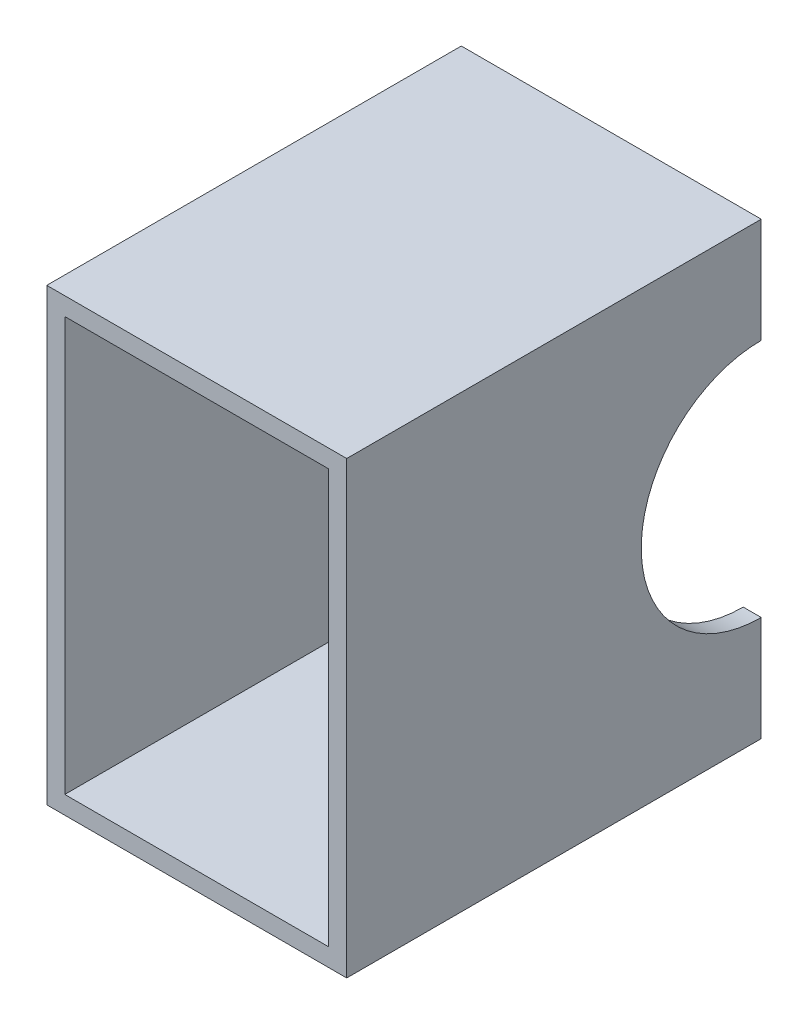
ISO-10303-21;
HEADER;
FILE_DESCRIPTION(('STEP AP214'),'2;1');
FILE_NAME('part.step','',(''),(''),'','','');
FILE_SCHEMA(('AUTOMOTIVE_DESIGN { 1 0 10303 214 1 1 1 1 }'));
ENDSEC;
DATA;
#1=APPLICATION_CONTEXT('core data for automotive mechanical design processes');
#2=APPLICATION_PROTOCOL_DEFINITION('international standard','automotive_design',2000,#1);
#3=PRODUCT_CONTEXT('',#1,'mechanical');
#4=PRODUCT('Part','Part','',(#3));
#5=PRODUCT_RELATED_PRODUCT_CATEGORY('part','',(#4));
#6=PRODUCT_DEFINITION_FORMATION('','',#4);
#7=PRODUCT_DEFINITION_CONTEXT('part definition',#1,'design');
#8=PRODUCT_DEFINITION('design','',#6,#7);
#9=PRODUCT_DEFINITION_SHAPE('','',#8);
#10=(LENGTH_UNIT() NAMED_UNIT(*) SI_UNIT(.MILLI.,.METRE.));
#11=(NAMED_UNIT(*) PLANE_ANGLE_UNIT() SI_UNIT($,.RADIAN.));
#12=(NAMED_UNIT(*) SI_UNIT($,.STERADIAN.) SOLID_ANGLE_UNIT());
#13=UNCERTAINTY_MEASURE_WITH_UNIT(LENGTH_MEASURE(1.E-05),#10,'distance_accuracy_value','');
#14=(GEOMETRIC_REPRESENTATION_CONTEXT(3) GLOBAL_UNCERTAINTY_ASSIGNED_CONTEXT((#13)) GLOBAL_UNIT_ASSIGNED_CONTEXT((#10,
#11,#12)) REPRESENTATION_CONTEXT('',''));
#15=CARTESIAN_POINT('',(0.,0.,0.));
#16=DIRECTION('',(0.,0.,1.));
#17=DIRECTION('',(1.,0.,0.));
#18=AXIS2_PLACEMENT_3D('',#15,#16,#17);
#19=CARTESIAN_POINT('',(0.,0.,0.));
#20=DIRECTION('',(0.,0.,-1.));
#21=DIRECTION('',(-1.,0.,0.));
#22=AXIS2_PLACEMENT_3D('',#19,#20,#21);
#23=PLANE('',#22);
#24=DIRECTION('',(1.,0.,0.));
#25=VECTOR('',#24,1.);
#26=CARTESIAN_POINT('',(-50.,40.,0.));
#27=LINE('',#26,#25);
#28=CARTESIAN_POINT('',(-50.,40.,0.));
#29=VERTEX_POINT('',#28);
#30=CARTESIAN_POINT('',(-44.,40.,0.));
#31=VERTEX_POINT('',#30);
#32=EDGE_CURVE('E47',#29,#31,#27,.T.);
#33=ORIENTED_EDGE('',*,*,#32,.F.);
#34=DIRECTION('',(0.,-1.,0.));
#35=VECTOR('',#34,1.);
#36=CARTESIAN_POINT('',(-50.,-75.,0.));
#37=LINE('',#36,#35);
#38=CARTESIAN_POINT('',(-50.,74.9999999999999,0.));
#39=VERTEX_POINT('',#38);
#40=EDGE_CURVE('E131',#39,#29,#37,.T.);
#41=ORIENTED_EDGE('',*,*,#40,.F.);
#42=DIRECTION('',(-1.,0.,0.));
#43=VECTOR('',#42,1.);
#44=CARTESIAN_POINT('',(-50.,74.9999999999999,0.));
#45=LINE('',#44,#43);
#46=CARTESIAN_POINT('',(50.,75.,0.));
#47=VERTEX_POINT('',#46);
#48=EDGE_CURVE('E154',#47,#39,#45,.T.);
#49=ORIENTED_EDGE('',*,*,#48,.F.);
#50=DIRECTION('',(0.,1.,0.));
#51=VECTOR('',#50,1.);
#52=CARTESIAN_POINT('',(50.,-75.,0.));
#53=LINE('',#52,#51);
#54=CARTESIAN_POINT('',(50.,40.,0.));
#55=VERTEX_POINT('',#54);
#56=EDGE_CURVE('E144',#55,#47,#53,.T.);
#57=ORIENTED_EDGE('',*,*,#56,.F.);
#58=CARTESIAN_POINT('',(44.,40.,0.));
#59=VERTEX_POINT('',#58);
#60=EDGE_CURVE('E136',#59,#55,#27,.T.);
#61=ORIENTED_EDGE('',*,*,#60,.F.);
#62=DIRECTION('',(0.,1.,0.));
#63=VECTOR('',#62,1.);
#64=CARTESIAN_POINT('',(44.,-69.,0.));
#65=LINE('',#64,#63);
#66=CARTESIAN_POINT('',(44.,69.,0.));
#67=VERTEX_POINT('',#66);
#68=EDGE_CURVE('E203',#59,#67,#65,.T.);
#69=ORIENTED_EDGE('',*,*,#68,.T.);
#70=DIRECTION('',(-1.,0.,0.));
#71=VECTOR('',#70,1.);
#72=CARTESIAN_POINT('',(-44.,69.,0.));
#73=LINE('',#72,#71);
#74=CARTESIAN_POINT('',(-44.,69.,0.));
#75=VERTEX_POINT('',#74);
#76=EDGE_CURVE('E198',#67,#75,#73,.T.);
#77=ORIENTED_EDGE('',*,*,#76,.T.);
#78=DIRECTION('',(0.,-1.,0.));
#79=VECTOR('',#78,1.);
#80=CARTESIAN_POINT('',(-44.,-69.,0.));
#81=LINE('',#80,#79);
#82=EDGE_CURVE('E133',#75,#31,#81,.T.);
#83=ORIENTED_EDGE('',*,*,#82,.T.);
#84=EDGE_LOOP('',(#33,#41,#49,#57,#61,#69,#77,#83));
#85=FACE_BOUND('',#84,.T.);
#86=ADVANCED_FACE('F32',(#85),#23,.T.);
#87=CARTESIAN_POINT('',(0.,0.,138.202315188089));
#88=DIRECTION('',(0.,0.,-1.));
#89=DIRECTION('',(-1.,0.,0.));
#90=AXIS2_PLACEMENT_3D('',#87,#88,#89);
#91=PLANE('',#90);
#92=DIRECTION('',(0.,-1.,0.));
#93=VECTOR('',#92,1.);
#94=CARTESIAN_POINT('',(-50.,-75.,138.202315188089));
#95=LINE('',#94,#93);
#96=CARTESIAN_POINT('',(-50.,74.9999999999999,138.202315188089));
#97=VERTEX_POINT('',#96);
#98=CARTESIAN_POINT('',(-50.,-75.,138.202315188089));
#99=VERTEX_POINT('',#98);
#100=EDGE_CURVE('E156',#97,#99,#95,.T.);
#101=ORIENTED_EDGE('',*,*,#100,.T.);
#102=DIRECTION('',(1.,0.,0.));
#103=VECTOR('',#102,1.);
#104=CARTESIAN_POINT('',(-50.,-75.,138.202315188089));
#105=LINE('',#104,#103);
#106=CARTESIAN_POINT('',(50.,-75.,138.202315188089));
#107=VERTEX_POINT('',#106);
#108=EDGE_CURVE('E169',#99,#107,#105,.T.);
#109=ORIENTED_EDGE('',*,*,#108,.T.);
#110=DIRECTION('',(0.,1.,0.));
#111=VECTOR('',#110,1.);
#112=CARTESIAN_POINT('',(50.,-75.,138.202315188089));
#113=LINE('',#112,#111);
#114=CARTESIAN_POINT('',(50.,75.,138.202315188089));
#115=VERTEX_POINT('',#114);
#116=EDGE_CURVE('E181',#107,#115,#113,.T.);
#117=ORIENTED_EDGE('',*,*,#116,.T.);
#118=DIRECTION('',(-1.,0.,0.));
#119=VECTOR('',#118,1.);
#120=CARTESIAN_POINT('',(-50.,74.9999999999999,138.202315188089));
#121=LINE('',#120,#119);
#122=EDGE_CURVE('E148',#115,#97,#121,.T.);
#123=ORIENTED_EDGE('',*,*,#122,.T.);
#124=EDGE_LOOP('',(#101,#109,#117,#123));
#125=FACE_BOUND('',#124,.T.);
#126=DIRECTION('',(0.,-1.,0.));
#127=VECTOR('',#126,1.);
#128=CARTESIAN_POINT('',(-44.,-69.,138.202315188089));
#129=LINE('',#128,#127);
#130=CARTESIAN_POINT('',(-44.,69.,138.202315188089));
#131=VERTEX_POINT('',#130);
#132=CARTESIAN_POINT('',(-44.,-69.,138.202315188089));
#133=VERTEX_POINT('',#132);
#134=EDGE_CURVE('E200',#131,#133,#129,.T.);
#135=ORIENTED_EDGE('',*,*,#134,.F.);
#136=DIRECTION('',(-1.,0.,0.));
#137=VECTOR('',#136,1.);
#138=CARTESIAN_POINT('',(-44.,69.,138.202315188089));
#139=LINE('',#138,#137);
#140=CARTESIAN_POINT('',(44.,69.,138.202315188089));
#141=VERTEX_POINT('',#140);
#142=EDGE_CURVE('E197',#141,#131,#139,.T.);
#143=ORIENTED_EDGE('',*,*,#142,.F.);
#144=DIRECTION('',(0.,1.,0.));
#145=VECTOR('',#144,1.);
#146=CARTESIAN_POINT('',(44.,-69.,138.202315188089));
#147=LINE('',#146,#145);
#148=CARTESIAN_POINT('',(44.,-69.,138.202315188089));
#149=VERTEX_POINT('',#148);
#150=EDGE_CURVE('E209',#149,#141,#147,.T.);
#151=ORIENTED_EDGE('',*,*,#150,.F.);
#152=DIRECTION('',(1.,0.,0.));
#153=VECTOR('',#152,1.);
#154=CARTESIAN_POINT('',(-44.,-69.,138.202315188089));
#155=LINE('',#154,#153);
#156=EDGE_CURVE('E212',#133,#149,#155,.T.);
#157=ORIENTED_EDGE('',*,*,#156,.F.);
#158=EDGE_LOOP('',(#135,#143,#151,#157));
#159=FACE_BOUND('',#158,.T.);
#160=ADVANCED_FACE('F237',(#125,#159),#91,.F.);
#161=DIRECTION('',(1.,0.,0.));
#162=VECTOR('',#161,1.);
#163=CARTESIAN_POINT('',(-50.,-40.,0.));
#164=LINE('',#163,#162);
#165=CARTESIAN_POINT('',(50.,-40.,0.));
#166=VERTEX_POINT('',#165);
#167=CARTESIAN_POINT('',(44.,-40.,0.));
#168=VERTEX_POINT('',#167);
#169=EDGE_CURVE('E54',#166,#168,#164,.F.);
#170=ORIENTED_EDGE('',*,*,#169,.F.);
#171=CARTESIAN_POINT('',(50.,-75.,0.));
#172=VERTEX_POINT('',#171);
#173=EDGE_CURVE('E151',#172,#166,#53,.T.);
#174=ORIENTED_EDGE('',*,*,#173,.F.);
#175=DIRECTION('',(1.,0.,0.));
#176=VECTOR('',#175,1.);
#177=CARTESIAN_POINT('',(-50.,-75.,0.));
#178=LINE('',#177,#176);
#179=CARTESIAN_POINT('',(-50.,-75.,0.));
#180=VERTEX_POINT('',#179);
#181=EDGE_CURVE('E141',#180,#172,#178,.T.);
#182=ORIENTED_EDGE('',*,*,#181,.F.);
#183=CARTESIAN_POINT('',(-50.,-40.,0.));
#184=VERTEX_POINT('',#183);
#185=EDGE_CURVE('E142',#184,#180,#37,.T.);
#186=ORIENTED_EDGE('',*,*,#185,.F.);
#187=CARTESIAN_POINT('',(-44.,-40.,0.));
#188=VERTEX_POINT('',#187);
#189=EDGE_CURVE('E121',#188,#184,#164,.F.);
#190=ORIENTED_EDGE('',*,*,#189,.F.);
#191=CARTESIAN_POINT('',(-44.,-69.,0.));
#192=VERTEX_POINT('',#191);
#193=EDGE_CURVE('E134',#188,#192,#81,.T.);
#194=ORIENTED_EDGE('',*,*,#193,.T.);
#195=DIRECTION('',(1.,0.,0.));
#196=VECTOR('',#195,1.);
#197=CARTESIAN_POINT('',(-44.,-69.,0.));
#198=LINE('',#197,#196);
#199=CARTESIAN_POINT('',(44.,-69.,0.));
#200=VERTEX_POINT('',#199);
#201=EDGE_CURVE('E204',#192,#200,#198,.T.);
#202=ORIENTED_EDGE('',*,*,#201,.T.);
#203=EDGE_CURVE('E201',#200,#168,#65,.T.);
#204=ORIENTED_EDGE('',*,*,#203,.T.);
#205=EDGE_LOOP('',(#170,#174,#182,#186,#190,#194,#202,#204));
#206=FACE_BOUND('',#205,.T.);
#207=ADVANCED_FACE('F173',(#206),#23,.T.);
#208=CARTESIAN_POINT('',(-50.,-75.,138.202315188089));
#209=DIRECTION('',(1.,0.,0.));
#210=DIRECTION('',(0.,1.,0.));
#211=AXIS2_PLACEMENT_3D('',#208,#209,#210);
#212=PLANE('',#211);
#213=ORIENTED_EDGE('',*,*,#40,.T.);
#214=CARTESIAN_POINT('',(-50.,0.,0.));
#215=DIRECTION('',(1.,0.,0.));
#216=DIRECTION('',(0.,0.,-1.));
#217=AXIS2_PLACEMENT_3D('',#214,#215,#216);
#218=CIRCLE('',#217,40.);
#219=EDGE_CURVE('E118',#29,#184,#218,.T.);
#220=ORIENTED_EDGE('',*,*,#219,.T.);
#221=ORIENTED_EDGE('',*,*,#185,.T.);
#222=DIRECTION('',(0.,0.,-1.));
#223=VECTOR('',#222,1.);
#224=CARTESIAN_POINT('',(-50.,-75.,138.202315188089));
#225=LINE('',#224,#223);
#226=EDGE_CURVE('E40',#99,#180,#225,.T.);
#227=ORIENTED_EDGE('',*,*,#226,.F.);
#228=ORIENTED_EDGE('',*,*,#100,.F.);
#229=DIRECTION('',(0.,0.,-1.));
#230=VECTOR('',#229,1.);
#231=CARTESIAN_POINT('',(-50.,74.9999999999999,138.202315188089));
#232=LINE('',#231,#230);
#233=EDGE_CURVE('E140',#97,#39,#232,.T.);
#234=ORIENTED_EDGE('',*,*,#233,.T.);
#235=EDGE_LOOP('',(#213,#220,#221,#227,#228,#234));
#236=FACE_BOUND('',#235,.T.);
#237=ADVANCED_FACE('F34',(#236),#212,.F.);
#238=CARTESIAN_POINT('',(-50.,-75.,138.202315188089));
#239=DIRECTION('',(0.,1.,0.));
#240=DIRECTION('',(0.,0.,1.));
#241=AXIS2_PLACEMENT_3D('',#238,#239,#240);
#242=PLANE('',#241);
#243=ORIENTED_EDGE('',*,*,#181,.T.);
#244=DIRECTION('',(0.,0.,-1.));
#245=VECTOR('',#244,1.);
#246=CARTESIAN_POINT('',(50.,-75.,138.202315188089));
#247=LINE('',#246,#245);
#248=EDGE_CURVE('E161',#107,#172,#247,.T.);
#249=ORIENTED_EDGE('',*,*,#248,.F.);
#250=ORIENTED_EDGE('',*,*,#108,.F.);
#251=ORIENTED_EDGE('',*,*,#226,.T.);
#252=EDGE_LOOP('',(#243,#249,#250,#251));
#253=FACE_BOUND('',#252,.T.);
#254=ADVANCED_FACE('F166',(#253),#242,.F.);
#255=CARTESIAN_POINT('',(50.,-75.,138.202315188089));
#256=DIRECTION('',(-1.,0.,0.));
#257=DIRECTION('',(0.,-1.,0.));
#258=AXIS2_PLACEMENT_3D('',#255,#256,#257);
#259=PLANE('',#258);
#260=ORIENTED_EDGE('',*,*,#173,.T.);
#261=CARTESIAN_POINT('',(50.,0.,0.));
#262=DIRECTION('',(1.,0.,0.));
#263=DIRECTION('',(0.,0.,-1.));
#264=AXIS2_PLACEMENT_3D('',#261,#262,#263);
#265=CIRCLE('',#264,40.);
#266=EDGE_CURVE('E125',#55,#166,#265,.T.);
#267=ORIENTED_EDGE('',*,*,#266,.F.);
#268=ORIENTED_EDGE('',*,*,#56,.T.);
#269=DIRECTION('',(0.,0.,-1.));
#270=VECTOR('',#269,1.);
#271=CARTESIAN_POINT('',(50.,75.,138.202315188089));
#272=LINE('',#271,#270);
#273=EDGE_CURVE('E158',#115,#47,#272,.T.);
#274=ORIENTED_EDGE('',*,*,#273,.F.);
#275=ORIENTED_EDGE('',*,*,#116,.F.);
#276=ORIENTED_EDGE('',*,*,#248,.T.);
#277=EDGE_LOOP('',(#260,#267,#268,#274,#275,#276));
#278=FACE_BOUND('',#277,.T.);
#279=ADVANCED_FACE('F177',(#278),#259,.F.);
#280=CARTESIAN_POINT('',(-50.,74.9999999999999,138.202315188089));
#281=DIRECTION('',(0.,-1.,0.));
#282=DIRECTION('',(1.,0.,0.));
#283=AXIS2_PLACEMENT_3D('',#280,#281,#282);
#284=PLANE('',#283);
#285=ORIENTED_EDGE('',*,*,#48,.T.);
#286=ORIENTED_EDGE('',*,*,#233,.F.);
#287=ORIENTED_EDGE('',*,*,#122,.F.);
#288=ORIENTED_EDGE('',*,*,#273,.T.);
#289=EDGE_LOOP('',(#285,#286,#287,#288));
#290=FACE_BOUND('',#289,.T.);
#291=ADVANCED_FACE('F249',(#290),#284,.F.);
#292=CARTESIAN_POINT('',(-44.,-69.,138.202315188089));
#293=DIRECTION('',(1.,0.,0.));
#294=DIRECTION('',(0.,0.,-1.));
#295=AXIS2_PLACEMENT_3D('',#292,#293,#294);
#296=PLANE('',#295);
#297=CARTESIAN_POINT('',(-44.,0.,0.));
#298=DIRECTION('',(1.,0.,0.));
#299=DIRECTION('',(0.,0.,-1.));
#300=AXIS2_PLACEMENT_3D('',#297,#298,#299);
#301=CIRCLE('',#300,40.);
#302=EDGE_CURVE('E215',#31,#188,#301,.T.);
#303=ORIENTED_EDGE('',*,*,#302,.F.);
#304=ORIENTED_EDGE('',*,*,#82,.F.);
#305=DIRECTION('',(0.,0.,-1.));
#306=VECTOR('',#305,1.);
#307=CARTESIAN_POINT('',(-44.,69.,138.202315188089));
#308=LINE('',#307,#306);
#309=EDGE_CURVE('E194',#131,#75,#308,.T.);
#310=ORIENTED_EDGE('',*,*,#309,.F.);
#311=ORIENTED_EDGE('',*,*,#134,.T.);
#312=DIRECTION('',(0.,0.,-1.));
#313=VECTOR('',#312,1.);
#314=CARTESIAN_POINT('',(-44.,-69.,138.202315188089));
#315=LINE('',#314,#313);
#316=EDGE_CURVE('E146',#133,#192,#315,.T.);
#317=ORIENTED_EDGE('',*,*,#316,.T.);
#318=ORIENTED_EDGE('',*,*,#193,.F.);
#319=EDGE_LOOP('',(#303,#304,#310,#311,#317,#318));
#320=FACE_BOUND('',#319,.T.);
#321=ADVANCED_FACE('F233',(#320),#296,.T.);
#322=CARTESIAN_POINT('',(-44.,-69.,138.202315188089));
#323=DIRECTION('',(0.,1.,0.));
#324=DIRECTION('',(0.,0.,1.));
#325=AXIS2_PLACEMENT_3D('',#322,#323,#324);
#326=PLANE('',#325);
#327=ORIENTED_EDGE('',*,*,#201,.F.);
#328=ORIENTED_EDGE('',*,*,#316,.F.);
#329=ORIENTED_EDGE('',*,*,#156,.T.);
#330=DIRECTION('',(0.,0.,-1.));
#331=VECTOR('',#330,1.);
#332=CARTESIAN_POINT('',(44.,-69.,138.202315188089));
#333=LINE('',#332,#331);
#334=EDGE_CURVE('E189',#149,#200,#333,.T.);
#335=ORIENTED_EDGE('',*,*,#334,.T.);
#336=EDGE_LOOP('',(#327,#328,#329,#335));
#337=FACE_BOUND('',#336,.T.);
#338=ADVANCED_FACE('F240',(#337),#326,.T.);
#339=CARTESIAN_POINT('',(44.,-69.,138.202315188089));
#340=DIRECTION('',(-1.,0.,0.));
#341=DIRECTION('',(0.,0.,1.));
#342=AXIS2_PLACEMENT_3D('',#339,#340,#341);
#343=PLANE('',#342);
#344=CARTESIAN_POINT('',(44.,0.,0.));
#345=DIRECTION('',(-1.,0.,0.));
#346=DIRECTION('',(0.,0.,1.));
#347=AXIS2_PLACEMENT_3D('',#344,#345,#346);
#348=CIRCLE('',#347,40.);
#349=EDGE_CURVE('E11',#168,#59,#348,.T.);
#350=ORIENTED_EDGE('',*,*,#349,.F.);
#351=ORIENTED_EDGE('',*,*,#203,.F.);
#352=ORIENTED_EDGE('',*,*,#334,.F.);
#353=ORIENTED_EDGE('',*,*,#150,.T.);
#354=DIRECTION('',(0.,0.,-1.));
#355=VECTOR('',#354,1.);
#356=CARTESIAN_POINT('',(44.,69.,138.202315188089));
#357=LINE('',#356,#355);
#358=EDGE_CURVE('E191',#141,#67,#357,.T.);
#359=ORIENTED_EDGE('',*,*,#358,.T.);
#360=ORIENTED_EDGE('',*,*,#68,.F.);
#361=EDGE_LOOP('',(#350,#351,#352,#353,#359,#360));
#362=FACE_BOUND('',#361,.T.);
#363=ADVANCED_FACE('F222',(#362),#343,.T.);
#364=CARTESIAN_POINT('',(-44.,69.,138.202315188089));
#365=DIRECTION('',(0.,-1.,0.));
#366=DIRECTION('',(0.,0.,-1.));
#367=AXIS2_PLACEMENT_3D('',#364,#365,#366);
#368=PLANE('',#367);
#369=ORIENTED_EDGE('',*,*,#76,.F.);
#370=ORIENTED_EDGE('',*,*,#358,.F.);
#371=ORIENTED_EDGE('',*,*,#142,.T.);
#372=ORIENTED_EDGE('',*,*,#309,.T.);
#373=EDGE_LOOP('',(#369,#370,#371,#372));
#374=FACE_BOUND('',#373,.T.);
#375=ADVANCED_FACE('F229',(#374),#368,.T.);
#376=CARTESIAN_POINT('',(-50.,0.,0.));
#377=DIRECTION('',(1.,0.,0.));
#378=DIRECTION('',(0.,0.,-1.));
#379=AXIS2_PLACEMENT_3D('',#376,#377,#378);
#380=CYLINDRICAL_SURFACE('',#379,40.);
#381=ORIENTED_EDGE('',*,*,#60,.T.);
#382=ORIENTED_EDGE('',*,*,#266,.T.);
#383=ORIENTED_EDGE('',*,*,#169,.T.);
#384=ORIENTED_EDGE('',*,*,#349,.T.);
#385=EDGE_LOOP('',(#381,#382,#383,#384));
#386=FACE_BOUND('',#385,.T.);
#387=ADVANCED_FACE('F218',(#386),#380,.F.);
#388=ORIENTED_EDGE('',*,*,#32,.T.);
#389=ORIENTED_EDGE('',*,*,#302,.T.);
#390=ORIENTED_EDGE('',*,*,#189,.T.);
#391=ORIENTED_EDGE('',*,*,#219,.F.);
#392=EDGE_LOOP('',(#388,#389,#390,#391));
#393=FACE_BOUND('',#392,.T.);
#394=ADVANCED_FACE('F119',(#393),#380,.F.);
#395=CLOSED_SHELL('',(#86,#160,#207,#237,#254,#279,#291,#321,#338,#363,#375,#387,#394));
#396=MANIFOLD_SOLID_BREP('B2',#395);
#397=ADVANCED_BREP_SHAPE_REPRESENTATION('',(#18,#396),#14);
#398=SHAPE_DEFINITION_REPRESENTATION(#9,#397);
ENDSEC;
END-ISO-10303-21;
